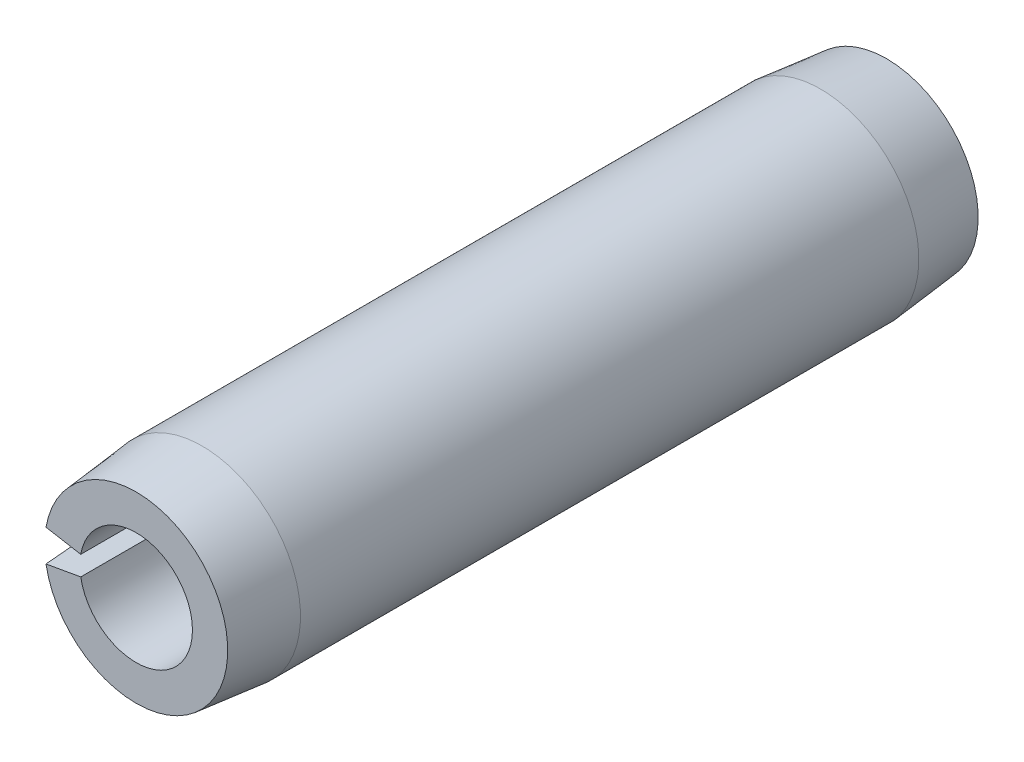
ISO-10303-21;
HEADER;
FILE_DESCRIPTION(('STEP AP214'),'2;1');
FILE_NAME('part.step','',(''),(''),'','','');
FILE_SCHEMA(('AUTOMOTIVE_DESIGN { 1 0 10303 214 1 1 1 1 }'));
ENDSEC;
DATA;
#1=APPLICATION_CONTEXT('core data for automotive mechanical design processes');
#2=APPLICATION_PROTOCOL_DEFINITION('international standard','automotive_design',2000,#1);
#3=PRODUCT_CONTEXT('',#1,'mechanical');
#4=PRODUCT('Part','Part','',(#3));
#5=PRODUCT_RELATED_PRODUCT_CATEGORY('part','',(#4));
#6=PRODUCT_DEFINITION_FORMATION('','',#4);
#7=PRODUCT_DEFINITION_CONTEXT('part definition',#1,'design');
#8=PRODUCT_DEFINITION('design','',#6,#7);
#9=PRODUCT_DEFINITION_SHAPE('','',#8);
#10=(LENGTH_UNIT() NAMED_UNIT(*) SI_UNIT(.MILLI.,.METRE.));
#11=(NAMED_UNIT(*) PLANE_ANGLE_UNIT() SI_UNIT($,.RADIAN.));
#12=(NAMED_UNIT(*) SI_UNIT($,.STERADIAN.) SOLID_ANGLE_UNIT());
#13=UNCERTAINTY_MEASURE_WITH_UNIT(LENGTH_MEASURE(1.E-05),#10,'distance_accuracy_value','');
#14=(GEOMETRIC_REPRESENTATION_CONTEXT(3) GLOBAL_UNCERTAINTY_ASSIGNED_CONTEXT((#13)) GLOBAL_UNIT_ASSIGNED_CONTEXT((#10,
#11,#12)) REPRESENTATION_CONTEXT('',''));
#15=CARTESIAN_POINT('',(0.,0.,0.));
#16=DIRECTION('',(0.,0.,1.));
#17=DIRECTION('',(1.,0.,0.));
#18=AXIS2_PLACEMENT_3D('',#15,#16,#17);
#19=CARTESIAN_POINT('',(0.,0.,6.35));
#20=DIRECTION('',(0.,0.,-1.));
#21=DIRECTION('',(-1.,0.,0.));
#22=AXIS2_PLACEMENT_3D('',#19,#20,#21);
#23=CYLINDRICAL_SURFACE('',#22,0.9525);
#24=CARTESIAN_POINT('',(0.,0.,-6.35));
#25=DIRECTION('',(0.,0.,-1.));
#26=DIRECTION('',(1.,0.,0.));
#27=AXIS2_PLACEMENT_3D('',#24,#25,#26);
#28=CIRCLE('',#27,0.9525);
#29=CARTESIAN_POINT('',(-0.938029384744128,0.165399889227748,-6.35));
#30=VERTEX_POINT('',#29);
#31=CARTESIAN_POINT('',(-0.938029384744128,-0.165399889227748,-6.35));
#32=VERTEX_POINT('',#31);
#33=EDGE_CURVE('E120',#30,#32,#28,.T.);
#34=ORIENTED_EDGE('',*,*,#33,.T.);
#35=DIRECTION('',(0.,0.,-1.));
#36=VECTOR('',#35,1.);
#37=CARTESIAN_POINT('',(-0.938029384744128,-0.165399889227748,6.35));
#38=LINE('',#37,#36);
#39=CARTESIAN_POINT('',(-0.938029384744128,-0.165399889227748,6.35));
#40=VERTEX_POINT('',#39);
#41=EDGE_CURVE('E11',#40,#32,#38,.T.);
#42=ORIENTED_EDGE('',*,*,#41,.F.);
#43=CARTESIAN_POINT('',(0.,0.,6.35));
#44=DIRECTION('',(0.,0.,-1.));
#45=DIRECTION('',(1.,0.,0.));
#46=AXIS2_PLACEMENT_3D('',#43,#44,#45);
#47=CIRCLE('',#46,0.9525);
#48=CARTESIAN_POINT('',(-0.938029384744128,0.165399889227748,6.35));
#49=VERTEX_POINT('',#48);
#50=EDGE_CURVE('E116',#49,#40,#47,.T.);
#51=ORIENTED_EDGE('',*,*,#50,.F.);
#52=DIRECTION('',(0.,0.,-1.));
#53=VECTOR('',#52,1.);
#54=CARTESIAN_POINT('',(-0.938029384744128,0.165399889227748,6.35));
#55=LINE('',#54,#53);
#56=EDGE_CURVE('E109',#49,#30,#55,.T.);
#57=ORIENTED_EDGE('',*,*,#56,.T.);
#58=EDGE_LOOP('',(#34,#42,#51,#57));
#59=FACE_BOUND('',#58,.T.);
#60=ADVANCED_FACE('F37',(#59),#23,.F.);
#61=CARTESIAN_POINT('',(-0.938029384744128,-0.165399889227748,6.35));
#62=DIRECTION('',(0.173648177666927,-0.984807753012209,0.));
#63=DIRECTION('',(0.984807753012209,0.173648177666927,0.));
#64=AXIS2_PLACEMENT_3D('',#61,#62,#63);
#65=PLANE('',#64);
#66=DIRECTION('',(0.,0.,-1.));
#67=VECTOR('',#66,1.);
#68=CARTESIAN_POINT('',(-1.63842465868641,-0.288898473184466,6.35));
#69=LINE('',#68,#67);
#70=CARTESIAN_POINT('',(-1.63842465868641,-0.288898473184467,5.2324));
#71=VERTEX_POINT('',#70);
#72=CARTESIAN_POINT('',(-1.63842465868641,-0.288898473184467,-5.2324));
#73=VERTEX_POINT('',#72);
#74=EDGE_CURVE('E44',#71,#73,#69,.T.);
#75=ORIENTED_EDGE('',*,*,#74,.F.);
#76=DIRECTION('',(-0.100196325582816,-0.0176673155681,-0.99481081734183));
#77=VECTOR('',#76,1.);
#78=CARTESIAN_POINT('',(0.,0.,21.4996888888889));
#79=LINE('',#78,#77);
#80=CARTESIAN_POINT('',(-1.52586113251712,-0.269050486477137,6.35));
#81=VERTEX_POINT('',#80);
#82=EDGE_CURVE('E91',#71,#81,#79,.F.);
#83=ORIENTED_EDGE('',*,*,#82,.T.);
#84=DIRECTION('',(-0.984807753012209,-0.173648177666927,0.));
#85=VECTOR('',#84,1.);
#86=CARTESIAN_POINT('',(-0.938029384744128,-0.165399889227748,6.35));
#87=LINE('',#86,#85);
#88=EDGE_CURVE('E124',#40,#81,#87,.T.);
#89=ORIENTED_EDGE('',*,*,#88,.F.);
#90=ORIENTED_EDGE('',*,*,#41,.T.);
#91=DIRECTION('',(-0.984807753012209,-0.173648177666927,0.));
#92=VECTOR('',#91,1.);
#93=CARTESIAN_POINT('',(-0.938029384744128,-0.165399889227748,-6.35));
#94=LINE('',#93,#92);
#95=CARTESIAN_POINT('',(-1.52586113251712,-0.269050486477137,-6.35));
#96=VERTEX_POINT('',#95);
#97=EDGE_CURVE('E117',#32,#96,#94,.T.);
#98=ORIENTED_EDGE('',*,*,#97,.T.);
#99=DIRECTION('',(0.100196325582816,0.0176673155681,-0.99481081734183));
#100=VECTOR('',#99,1.);
#101=CARTESIAN_POINT('',(0.,0.,-21.4996888888889));
#102=LINE('',#101,#100);
#103=EDGE_CURVE('E59',#96,#73,#102,.F.);
#104=ORIENTED_EDGE('',*,*,#103,.T.);
#105=EDGE_LOOP('',(#75,#83,#89,#90,#98,#104));
#106=FACE_BOUND('',#105,.T.);
#107=ADVANCED_FACE('F138',(#106),#65,.F.);
#108=CARTESIAN_POINT('',(0.,0.,6.35));
#109=DIRECTION('',(0.,0.,-1.));
#110=DIRECTION('',(-1.,0.,0.));
#111=AXIS2_PLACEMENT_3D('',#108,#109,#110);
#112=CYLINDRICAL_SURFACE('',#111,1.6637);
#113=DIRECTION('',(0.,0.,-1.));
#114=VECTOR('',#113,1.);
#115=CARTESIAN_POINT('',(-1.63842465868641,0.288898473184467,6.35));
#116=LINE('',#115,#114);
#117=CARTESIAN_POINT('',(-1.63842465868641,0.288898473184467,5.2324));
#118=VERTEX_POINT('',#117);
#119=CARTESIAN_POINT('',(-1.63842465868641,0.288898473184467,-5.2324));
#120=VERTEX_POINT('',#119);
#121=EDGE_CURVE('E101',#118,#120,#116,.T.);
#122=ORIENTED_EDGE('',*,*,#121,.F.);
#123=CARTESIAN_POINT('',(0.,0.,5.2324));
#124=DIRECTION('',(0.,0.,-1.));
#125=DIRECTION('',(-1.,0.,0.));
#126=AXIS2_PLACEMENT_3D('',#123,#124,#125);
#127=CIRCLE('',#126,1.6637);
#128=EDGE_CURVE('E88',#118,#71,#127,.T.);
#129=ORIENTED_EDGE('',*,*,#128,.T.);
#130=ORIENTED_EDGE('',*,*,#74,.T.);
#131=CARTESIAN_POINT('',(0.,0.,-5.2324));
#132=DIRECTION('',(0.,0.,-1.));
#133=DIRECTION('',(-1.,0.,0.));
#134=AXIS2_PLACEMENT_3D('',#131,#132,#133);
#135=CIRCLE('',#134,1.6637);
#136=EDGE_CURVE('E108',#120,#73,#135,.T.);
#137=ORIENTED_EDGE('',*,*,#136,.F.);
#138=EDGE_LOOP('',(#122,#129,#130,#137));
#139=FACE_BOUND('',#138,.T.);
#140=ADVANCED_FACE('F107',(#139),#112,.T.);
#141=CARTESIAN_POINT('',(-1.63842465868641,0.288898473184467,6.35));
#142=DIRECTION('',(0.173648177666927,0.984807753012209,0.));
#143=DIRECTION('',(-0.984807753012209,0.173648177666927,0.));
#144=AXIS2_PLACEMENT_3D('',#141,#142,#143);
#145=PLANE('',#144);
#146=DIRECTION('',(0.984807753012209,-0.173648177666927,0.));
#147=VECTOR('',#146,1.);
#148=CARTESIAN_POINT('',(-1.63842465868641,0.288898473184467,6.35));
#149=LINE('',#148,#147);
#150=CARTESIAN_POINT('',(-1.52586113251712,0.269050486477137,6.35));
#151=VERTEX_POINT('',#150);
#152=EDGE_CURVE('E104',#151,#49,#149,.T.);
#153=ORIENTED_EDGE('',*,*,#152,.F.);
#154=DIRECTION('',(0.100196325582816,-0.0176673155681,0.99481081734183));
#155=VECTOR('',#154,1.);
#156=CARTESIAN_POINT('',(0.,0.,21.4996888888889));
#157=LINE('',#156,#155);
#158=EDGE_CURVE('E51',#151,#118,#157,.F.);
#159=ORIENTED_EDGE('',*,*,#158,.T.);
#160=ORIENTED_EDGE('',*,*,#121,.T.);
#161=DIRECTION('',(-0.100196325582816,0.0176673155681,0.99481081734183));
#162=VECTOR('',#161,1.);
#163=CARTESIAN_POINT('',(0.,0.,-21.4996888888889));
#164=LINE('',#163,#162);
#165=CARTESIAN_POINT('',(-1.52586113251712,0.269050486477137,-6.35));
#166=VERTEX_POINT('',#165);
#167=EDGE_CURVE('E130',#120,#166,#164,.F.);
#168=ORIENTED_EDGE('',*,*,#167,.T.);
#169=DIRECTION('',(0.984807753012209,-0.173648177666927,0.));
#170=VECTOR('',#169,1.);
#171=CARTESIAN_POINT('',(-1.63842465868641,0.288898473184467,-6.35));
#172=LINE('',#171,#170);
#173=EDGE_CURVE('E114',#166,#30,#172,.T.);
#174=ORIENTED_EDGE('',*,*,#173,.T.);
#175=ORIENTED_EDGE('',*,*,#56,.F.);
#176=EDGE_LOOP('',(#153,#159,#160,#168,#174,#175));
#177=FACE_BOUND('',#176,.T.);
#178=ADVANCED_FACE('F99',(#177),#145,.F.);
#179=CARTESIAN_POINT('',(0.,0.,6.35));
#180=DIRECTION('',(0.,0.,1.));
#181=DIRECTION('',(1.,0.,0.));
#182=AXIS2_PLACEMENT_3D('',#179,#180,#181);
#183=PLANE('',#182);
#184=CARTESIAN_POINT('',(0.,0.,6.35));
#185=DIRECTION('',(0.,0.,-1.));
#186=DIRECTION('',(-1.,0.,0.));
#187=AXIS2_PLACEMENT_3D('',#184,#185,#186);
#188=CIRCLE('',#187,1.5494);
#189=EDGE_CURVE('E95',#151,#81,#188,.T.);
#190=ORIENTED_EDGE('',*,*,#189,.F.);
#191=ORIENTED_EDGE('',*,*,#152,.T.);
#192=ORIENTED_EDGE('',*,*,#50,.T.);
#193=ORIENTED_EDGE('',*,*,#88,.T.);
#194=EDGE_LOOP('',(#190,#191,#192,#193));
#195=FACE_BOUND('',#194,.T.);
#196=ADVANCED_FACE('F139',(#195),#183,.T.);
#197=CARTESIAN_POINT('',(0.,0.,-6.35));
#198=DIRECTION('',(0.,0.,1.));
#199=DIRECTION('',(1.,0.,0.));
#200=AXIS2_PLACEMENT_3D('',#197,#198,#199);
#201=PLANE('',#200);
#202=ORIENTED_EDGE('',*,*,#173,.F.);
#203=CARTESIAN_POINT('',(0.,0.,-6.35));
#204=DIRECTION('',(0.,0.,-1.));
#205=DIRECTION('',(-1.,0.,0.));
#206=AXIS2_PLACEMENT_3D('',#203,#204,#205);
#207=CIRCLE('',#206,1.5494);
#208=EDGE_CURVE('E132',#166,#96,#207,.T.);
#209=ORIENTED_EDGE('',*,*,#208,.T.);
#210=ORIENTED_EDGE('',*,*,#97,.F.);
#211=ORIENTED_EDGE('',*,*,#33,.F.);
#212=EDGE_LOOP('',(#202,#209,#210,#211));
#213=FACE_BOUND('',#212,.T.);
#214=ADVANCED_FACE('F146',(#213),#201,.F.);
#215=CARTESIAN_POINT('',(0.,0.,-5.2324));
#216=DIRECTION('',(0.,0.,1.));
#217=DIRECTION('',(1.,0.,0.));
#218=AXIS2_PLACEMENT_3D('',#215,#216,#217);
#219=CONICAL_SURFACE('',#218,1.6637,0.101918367480874);
#220=ORIENTED_EDGE('',*,*,#208,.F.);
#221=ORIENTED_EDGE('',*,*,#167,.F.);
#222=ORIENTED_EDGE('',*,*,#136,.T.);
#223=ORIENTED_EDGE('',*,*,#103,.F.);
#224=EDGE_LOOP('',(#220,#221,#222,#223));
#225=FACE_BOUND('',#224,.T.);
#226=ADVANCED_FACE('F147',(#225),#219,.T.);
#227=CARTESIAN_POINT('',(0.,0.,6.35));
#228=DIRECTION('',(0.,0.,-1.));
#229=DIRECTION('',(-1.,0.,0.));
#230=AXIS2_PLACEMENT_3D('',#227,#228,#229);
#231=CONICAL_SURFACE('',#230,1.5494,0.101918367480874);
#232=ORIENTED_EDGE('',*,*,#128,.F.);
#233=ORIENTED_EDGE('',*,*,#158,.F.);
#234=ORIENTED_EDGE('',*,*,#189,.T.);
#235=ORIENTED_EDGE('',*,*,#82,.F.);
#236=EDGE_LOOP('',(#232,#233,#234,#235));
#237=FACE_BOUND('',#236,.T.);
#238=ADVANCED_FACE('F89',(#237),#231,.T.);
#239=CLOSED_SHELL('',(#60,#107,#140,#178,#196,#214,#226,#238));
#240=MANIFOLD_SOLID_BREP('B2',#239);
#241=ADVANCED_BREP_SHAPE_REPRESENTATION('',(#18,#240),#14);
#242=SHAPE_DEFINITION_REPRESENTATION(#9,#241);
ENDSEC;
END-ISO-10303-21;
